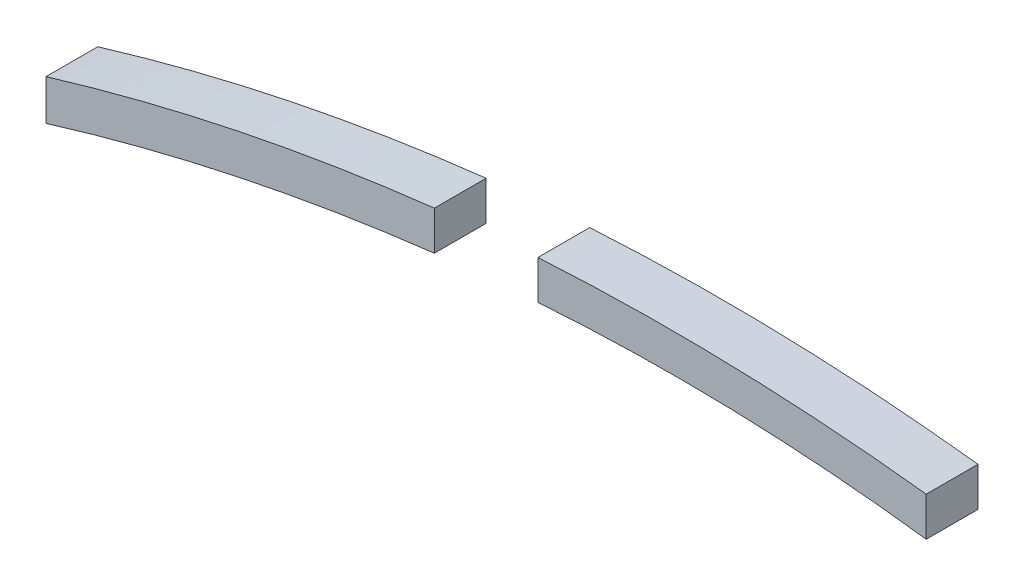
ISO-10303-21;
HEADER;
FILE_DESCRIPTION(('STEP AP214'),'2;1');
FILE_NAME('part.step','',(''),(''),'','','');
FILE_SCHEMA(('AUTOMOTIVE_DESIGN { 1 0 10303 214 1 1 1 1 }'));
ENDSEC;
DATA;
#1=APPLICATION_CONTEXT('core data for automotive mechanical design processes');
#2=APPLICATION_PROTOCOL_DEFINITION('international standard','automotive_design',2000,#1);
#3=PRODUCT_CONTEXT('',#1,'mechanical');
#4=PRODUCT('Part','Part','',(#3));
#5=PRODUCT_RELATED_PRODUCT_CATEGORY('part','',(#4));
#6=PRODUCT_DEFINITION_FORMATION('','',#4);
#7=PRODUCT_DEFINITION_CONTEXT('part definition',#1,'design');
#8=PRODUCT_DEFINITION('design','',#6,#7);
#9=PRODUCT_DEFINITION_SHAPE('','',#8);
#10=(LENGTH_UNIT() NAMED_UNIT(*) SI_UNIT(.MILLI.,.METRE.));
#11=(NAMED_UNIT(*) PLANE_ANGLE_UNIT() SI_UNIT($,.RADIAN.));
#12=(NAMED_UNIT(*) SI_UNIT($,.STERADIAN.) SOLID_ANGLE_UNIT());
#13=UNCERTAINTY_MEASURE_WITH_UNIT(LENGTH_MEASURE(1.E-05),#10,'distance_accuracy_value','');
#14=(GEOMETRIC_REPRESENTATION_CONTEXT(3) GLOBAL_UNCERTAINTY_ASSIGNED_CONTEXT((#13)) GLOBAL_UNIT_ASSIGNED_CONTEXT((#10,
#11,#12)) REPRESENTATION_CONTEXT('',''));
#15=CARTESIAN_POINT('',(0.,0.,0.));
#16=DIRECTION('',(0.,0.,1.));
#17=DIRECTION('',(1.,0.,0.));
#18=AXIS2_PLACEMENT_3D('',#15,#16,#17);
#19=CARTESIAN_POINT('',(7.12841427033649,-65.2005141054153,2.));
#20=DIRECTION('',(0.,0.,-1.));
#21=DIRECTION('',(-1.,0.,0.));
#22=AXIS2_PLACEMENT_3D('',#19,#20,#21);
#23=CYLINDRICAL_SURFACE('',#22,85.5053699096559);
#24=CARTESIAN_POINT('',(7.12841427033649,-65.2005141054153,0.));
#25=DIRECTION('',(0.,0.,1.));
#26=DIRECTION('',(-1.,0.,0.));
#27=AXIS2_PLACEMENT_3D('',#24,#25,#26);
#28=CIRCLE('',#27,85.5053699096559);
#29=CARTESIAN_POINT('',(17.,19.7331074973928,0.));
#30=VERTEX_POINT('',#29);
#31=CARTESIAN_POINT('',(2.,20.1509220304746,0.));
#32=VERTEX_POINT('',#31);
#33=EDGE_CURVE('E111',#30,#32,#28,.T.);
#34=ORIENTED_EDGE('',*,*,#33,.T.);
#35=DIRECTION('',(0.,0.,-1.));
#36=VECTOR('',#35,1.);
#37=CARTESIAN_POINT('',(2.,20.1509220304746,2.));
#38=LINE('',#37,#36);
#39=CARTESIAN_POINT('',(2.,20.1509220304746,2.));
#40=VERTEX_POINT('',#39);
#41=EDGE_CURVE('E12',#40,#32,#38,.T.);
#42=ORIENTED_EDGE('',*,*,#41,.F.);
#43=CARTESIAN_POINT('',(7.12841427033649,-65.2005141054153,2.));
#44=DIRECTION('',(0.,0.,1.));
#45=DIRECTION('',(-1.,0.,0.));
#46=AXIS2_PLACEMENT_3D('',#43,#44,#45);
#47=CIRCLE('',#46,85.5053699096559);
#48=CARTESIAN_POINT('',(17.,19.7331074973928,2.));
#49=VERTEX_POINT('',#48);
#50=EDGE_CURVE('E99',#49,#40,#47,.T.);
#51=ORIENTED_EDGE('',*,*,#50,.F.);
#52=DIRECTION('',(0.,0.,-1.));
#53=VECTOR('',#52,1.);
#54=CARTESIAN_POINT('',(17.,19.7331074973928,2.));
#55=LINE('',#54,#53);
#56=EDGE_CURVE('E107',#49,#30,#55,.T.);
#57=ORIENTED_EDGE('',*,*,#56,.T.);
#58=EDGE_LOOP('',(#34,#42,#51,#57));
#59=FACE_BOUND('',#58,.T.);
#60=ADVANCED_FACE('F48',(#59),#23,.T.);
#61=CARTESIAN_POINT('',(2.,20.1509220304746,2.));
#62=DIRECTION('',(1.,0.,0.));
#63=DIRECTION('',(0.,0.,-1.));
#64=AXIS2_PLACEMENT_3D('',#61,#62,#63);
#65=PLANE('',#64);
#66=DIRECTION('',(0.,-1.,0.));
#67=VECTOR('',#66,1.);
#68=CARTESIAN_POINT('',(2.,20.1509220304746,0.));
#69=LINE('',#68,#67);
#70=CARTESIAN_POINT('',(2.,18.6478527622486,0.));
#71=VERTEX_POINT('',#70);
#72=EDGE_CURVE('E103',#32,#71,#69,.T.);
#73=ORIENTED_EDGE('',*,*,#72,.T.);
#74=DIRECTION('',(0.,0.,-1.));
#75=VECTOR('',#74,1.);
#76=CARTESIAN_POINT('',(2.,18.6478527622486,2.));
#77=LINE('',#76,#75);
#78=CARTESIAN_POINT('',(2.,18.6478527622486,2.));
#79=VERTEX_POINT('',#78);
#80=EDGE_CURVE('E56',#79,#71,#77,.T.);
#81=ORIENTED_EDGE('',*,*,#80,.F.);
#82=DIRECTION('',(0.,-1.,0.));
#83=VECTOR('',#82,1.);
#84=CARTESIAN_POINT('',(2.,20.1509220304746,2.));
#85=LINE('',#84,#83);
#86=EDGE_CURVE('E94',#40,#79,#85,.T.);
#87=ORIENTED_EDGE('',*,*,#86,.F.);
#88=ORIENTED_EDGE('',*,*,#41,.T.);
#89=EDGE_LOOP('',(#73,#81,#87,#88));
#90=FACE_BOUND('',#89,.T.);
#91=ADVANCED_FACE('F102',(#90),#65,.F.);
#92=CARTESIAN_POINT('',(7.37690287780733,-56.6827347101204,2.));
#93=DIRECTION('',(0.,0.,-1.));
#94=DIRECTION('',(-1.,0.,0.));
#95=AXIS2_PLACEMENT_3D('',#92,#93,#94);
#96=CYLINDRICAL_SURFACE('',#95,75.5222384035961);
#97=CARTESIAN_POINT('',(7.37690287780733,-56.6827347101204,0.));
#98=DIRECTION('',(0.,0.,-1.));
#99=DIRECTION('',(-1.,0.,0.));
#100=AXIS2_PLACEMENT_3D('',#97,#98,#99);
#101=CIRCLE('',#100,75.5222384035961);
#102=CARTESIAN_POINT('',(17.,18.2239038158905,0.));
#103=VERTEX_POINT('',#102);
#104=EDGE_CURVE('E81',#71,#103,#101,.T.);
#105=ORIENTED_EDGE('',*,*,#104,.T.);
#106=DIRECTION('',(0.,0.,-1.));
#107=VECTOR('',#106,1.);
#108=CARTESIAN_POINT('',(17.,18.2239038158905,2.));
#109=LINE('',#108,#107);
#110=CARTESIAN_POINT('',(17.,18.2239038158905,2.));
#111=VERTEX_POINT('',#110);
#112=EDGE_CURVE('E104',#111,#103,#109,.T.);
#113=ORIENTED_EDGE('',*,*,#112,.F.);
#114=CARTESIAN_POINT('',(7.37690287780733,-56.6827347101204,2.));
#115=DIRECTION('',(0.,0.,-1.));
#116=DIRECTION('',(-1.,0.,0.));
#117=AXIS2_PLACEMENT_3D('',#114,#115,#116);
#118=CIRCLE('',#117,75.5222384035961);
#119=EDGE_CURVE('E97',#79,#111,#118,.T.);
#120=ORIENTED_EDGE('',*,*,#119,.F.);
#121=ORIENTED_EDGE('',*,*,#80,.T.);
#122=EDGE_LOOP('',(#105,#113,#120,#121));
#123=FACE_BOUND('',#122,.T.);
#124=ADVANCED_FACE('F105',(#123),#96,.F.);
#125=CARTESIAN_POINT('',(17.,19.7331074973928,2.));
#126=DIRECTION('',(-1.,0.,0.));
#127=DIRECTION('',(0.,-1.,0.));
#128=AXIS2_PLACEMENT_3D('',#125,#126,#127);
#129=PLANE('',#128);
#130=DIRECTION('',(0.,1.,0.));
#131=VECTOR('',#130,1.);
#132=CARTESIAN_POINT('',(17.,19.7331074973928,0.));
#133=LINE('',#132,#131);
#134=EDGE_CURVE('E87',#103,#30,#133,.T.);
#135=ORIENTED_EDGE('',*,*,#134,.T.);
#136=ORIENTED_EDGE('',*,*,#56,.F.);
#137=DIRECTION('',(0.,1.,0.));
#138=VECTOR('',#137,1.);
#139=CARTESIAN_POINT('',(17.,19.7331074973928,2.));
#140=LINE('',#139,#138);
#141=EDGE_CURVE('E64',#111,#49,#140,.T.);
#142=ORIENTED_EDGE('',*,*,#141,.F.);
#143=ORIENTED_EDGE('',*,*,#112,.T.);
#144=EDGE_LOOP('',(#135,#136,#142,#143));
#145=FACE_BOUND('',#144,.T.);
#146=ADVANCED_FACE('F118',(#145),#129,.F.);
#147=CARTESIAN_POINT('',(7.12841427033649,-65.2005141054153,2.));
#148=DIRECTION('',(0.,0.,-1.));
#149=DIRECTION('',(-1.,0.,0.));
#150=AXIS2_PLACEMENT_3D('',#147,#148,#149);
#151=PLANE('',#150);
#152=ORIENTED_EDGE('',*,*,#50,.T.);
#153=ORIENTED_EDGE('',*,*,#86,.T.);
#154=ORIENTED_EDGE('',*,*,#119,.T.);
#155=ORIENTED_EDGE('',*,*,#141,.T.);
#156=EDGE_LOOP('',(#152,#153,#154,#155));
#157=FACE_BOUND('',#156,.T.);
#158=ADVANCED_FACE('F95',(#157),#151,.F.);
#159=CARTESIAN_POINT('',(7.12841427033649,-65.2005141054153,0.));
#160=DIRECTION('',(0.,0.,-1.));
#161=DIRECTION('',(-1.,0.,0.));
#162=AXIS2_PLACEMENT_3D('',#159,#160,#161);
#163=PLANE('',#162);
#164=ORIENTED_EDGE('',*,*,#33,.F.);
#165=ORIENTED_EDGE('',*,*,#134,.F.);
#166=ORIENTED_EDGE('',*,*,#104,.F.);
#167=ORIENTED_EDGE('',*,*,#72,.F.);
#168=EDGE_LOOP('',(#164,#165,#166,#167));
#169=FACE_BOUND('',#168,.T.);
#170=ADVANCED_FACE('F121',(#169),#163,.T.);
#171=CLOSED_SHELL('',(#60,#91,#124,#146,#158,#170));
#172=MANIFOLD_SOLID_BREP('B2',#171);
#173=CARTESIAN_POINT('',(7.70108533717899,-64.9807828312889,2.));
#174=DIRECTION('',(0.,0.,-1.));
#175=DIRECTION('',(-1.,0.,0.));
#176=AXIS2_PLACEMENT_3D('',#173,#174,#175);
#177=CYLINDRICAL_SURFACE('',#176,85.3348762589931);
#178=CARTESIAN_POINT('',(7.70108533717899,-64.9807828312889,0.));
#179=DIRECTION('',(0.,0.,1.));
#180=DIRECTION('',(-1.,0.,0.));
#181=AXIS2_PLACEMENT_3D('',#178,#179,#180);
#182=CIRCLE('',#181,85.3348762589931);
#183=CARTESIAN_POINT('',(-2.,19.8008782129395,0.));
#184=VERTEX_POINT('',#183);
#185=CARTESIAN_POINT('',(-17.,16.700901096646,0.));
#186=VERTEX_POINT('',#185);
#187=EDGE_CURVE('E234',#184,#186,#182,.T.);
#188=ORIENTED_EDGE('',*,*,#187,.T.);
#189=DIRECTION('',(0.,0.,-1.));
#190=VECTOR('',#189,1.);
#191=CARTESIAN_POINT('',(-17.,16.700901096646,2.));
#192=LINE('',#191,#190);
#193=CARTESIAN_POINT('',(-17.,16.700901096646,2.));
#194=VERTEX_POINT('',#193);
#195=EDGE_CURVE('E46',#194,#186,#192,.T.);
#196=ORIENTED_EDGE('',*,*,#195,.F.);
#197=CARTESIAN_POINT('',(7.70108533717899,-64.9807828312889,2.));
#198=DIRECTION('',(0.,0.,1.));
#199=DIRECTION('',(-1.,0.,0.));
#200=AXIS2_PLACEMENT_3D('',#197,#198,#199);
#201=CIRCLE('',#200,85.3348762589931);
#202=CARTESIAN_POINT('',(-2.,19.8008782129395,2.));
#203=VERTEX_POINT('',#202);
#204=EDGE_CURVE('E222',#203,#194,#201,.T.);
#205=ORIENTED_EDGE('',*,*,#204,.F.);
#206=DIRECTION('',(0.,0.,-1.));
#207=VECTOR('',#206,1.);
#208=CARTESIAN_POINT('',(-2.,19.8008782129395,2.));
#209=LINE('',#208,#207);
#210=EDGE_CURVE('E230',#203,#184,#209,.T.);
#211=ORIENTED_EDGE('',*,*,#210,.T.);
#212=EDGE_LOOP('',(#188,#196,#205,#211));
#213=FACE_BOUND('',#212,.T.);
#214=ADVANCED_FACE('F171',(#213),#177,.T.);
#215=CARTESIAN_POINT('',(-17.,16.700901096646,2.));
#216=DIRECTION('',(1.,0.,0.));
#217=DIRECTION('',(0.,1.,0.));
#218=AXIS2_PLACEMENT_3D('',#215,#216,#217);
#219=PLANE('',#218);
#220=DIRECTION('',(0.,-1.,0.));
#221=VECTOR('',#220,1.);
#222=CARTESIAN_POINT('',(-17.,16.700901096646,0.));
#223=LINE('',#222,#221);
#224=CARTESIAN_POINT('',(-17.,15.1360360272765,0.));
#225=VERTEX_POINT('',#224);
#226=EDGE_CURVE('E226',#186,#225,#223,.T.);
#227=ORIENTED_EDGE('',*,*,#226,.T.);
#228=DIRECTION('',(0.,0.,-1.));
#229=VECTOR('',#228,1.);
#230=CARTESIAN_POINT('',(-17.,15.1360360272765,2.));
#231=LINE('',#230,#229);
#232=CARTESIAN_POINT('',(-17.,15.1360360272765,2.));
#233=VERTEX_POINT('',#232);
#234=EDGE_CURVE('E179',#233,#225,#231,.T.);
#235=ORIENTED_EDGE('',*,*,#234,.F.);
#236=DIRECTION('',(0.,-1.,0.));
#237=VECTOR('',#236,1.);
#238=CARTESIAN_POINT('',(-17.,16.700901096646,2.));
#239=LINE('',#238,#237);
#240=EDGE_CURVE('E217',#194,#233,#239,.T.);
#241=ORIENTED_EDGE('',*,*,#240,.F.);
#242=ORIENTED_EDGE('',*,*,#195,.T.);
#243=EDGE_LOOP('',(#227,#235,#241,#242));
#244=FACE_BOUND('',#243,.T.);
#245=ADVANCED_FACE('F225',(#244),#219,.F.);
#246=CARTESIAN_POINT('',(7.86610589388057,-65.8419977222149,2.));
#247=DIRECTION('',(0.,0.,-1.));
#248=DIRECTION('',(-1.,0.,0.));
#249=AXIS2_PLACEMENT_3D('',#246,#247,#248);
#250=CYLINDRICAL_SURFACE('',#249,84.7098882791109);
#251=CARTESIAN_POINT('',(7.86610589388057,-65.8419977222149,0.));
#252=DIRECTION('',(0.,0.,-1.));
#253=DIRECTION('',(-1.,0.,0.));
#254=AXIS2_PLACEMENT_3D('',#251,#252,#253);
#255=CIRCLE('',#254,84.7098882791109);
#256=CARTESIAN_POINT('',(-1.99999999999999,18.2913792856658,0.));
#257=VERTEX_POINT('',#256);
#258=EDGE_CURVE('E204',#225,#257,#255,.T.);
#259=ORIENTED_EDGE('',*,*,#258,.T.);
#260=DIRECTION('',(0.,0.,-1.));
#261=VECTOR('',#260,1.);
#262=CARTESIAN_POINT('',(-1.99999999999999,18.2913792856658,2.));
#263=LINE('',#262,#261);
#264=CARTESIAN_POINT('',(-1.99999999999999,18.2913792856658,2.));
#265=VERTEX_POINT('',#264);
#266=EDGE_CURVE('E227',#265,#257,#263,.T.);
#267=ORIENTED_EDGE('',*,*,#266,.F.);
#268=CARTESIAN_POINT('',(7.86610589388057,-65.8419977222149,2.));
#269=DIRECTION('',(0.,0.,-1.));
#270=DIRECTION('',(-1.,0.,0.));
#271=AXIS2_PLACEMENT_3D('',#268,#269,#270);
#272=CIRCLE('',#271,84.7098882791109);
#273=EDGE_CURVE('E220',#233,#265,#272,.T.);
#274=ORIENTED_EDGE('',*,*,#273,.F.);
#275=ORIENTED_EDGE('',*,*,#234,.T.);
#276=EDGE_LOOP('',(#259,#267,#274,#275));
#277=FACE_BOUND('',#276,.T.);
#278=ADVANCED_FACE('F228',(#277),#250,.F.);
#279=CARTESIAN_POINT('',(-2.,19.8008782129395,2.));
#280=DIRECTION('',(-1.,0.,0.));
#281=DIRECTION('',(0.,-1.,0.));
#282=AXIS2_PLACEMENT_3D('',#279,#280,#281);
#283=PLANE('',#282);
#284=DIRECTION('',(0.,1.,0.));
#285=VECTOR('',#284,1.);
#286=CARTESIAN_POINT('',(-2.,19.8008782129395,0.));
#287=LINE('',#286,#285);
#288=EDGE_CURVE('E210',#257,#184,#287,.T.);
#289=ORIENTED_EDGE('',*,*,#288,.T.);
#290=ORIENTED_EDGE('',*,*,#210,.F.);
#291=DIRECTION('',(0.,1.,0.));
#292=VECTOR('',#291,1.);
#293=CARTESIAN_POINT('',(-2.,19.8008782129395,2.));
#294=LINE('',#293,#292);
#295=EDGE_CURVE('E187',#265,#203,#294,.T.);
#296=ORIENTED_EDGE('',*,*,#295,.F.);
#297=ORIENTED_EDGE('',*,*,#266,.T.);
#298=EDGE_LOOP('',(#289,#290,#296,#297));
#299=FACE_BOUND('',#298,.T.);
#300=ADVANCED_FACE('F241',(#299),#283,.F.);
#301=CARTESIAN_POINT('',(7.70108533717899,-64.9807828312889,2.));
#302=DIRECTION('',(0.,0.,-1.));
#303=DIRECTION('',(-1.,0.,0.));
#304=AXIS2_PLACEMENT_3D('',#301,#302,#303);
#305=PLANE('',#304);
#306=ORIENTED_EDGE('',*,*,#204,.T.);
#307=ORIENTED_EDGE('',*,*,#240,.T.);
#308=ORIENTED_EDGE('',*,*,#273,.T.);
#309=ORIENTED_EDGE('',*,*,#295,.T.);
#310=EDGE_LOOP('',(#306,#307,#308,#309));
#311=FACE_BOUND('',#310,.T.);
#312=ADVANCED_FACE('F218',(#311),#305,.F.);
#313=CARTESIAN_POINT('',(7.70108533717899,-64.9807828312889,0.));
#314=DIRECTION('',(0.,0.,-1.));
#315=DIRECTION('',(-1.,0.,0.));
#316=AXIS2_PLACEMENT_3D('',#313,#314,#315);
#317=PLANE('',#316);
#318=ORIENTED_EDGE('',*,*,#187,.F.);
#319=ORIENTED_EDGE('',*,*,#288,.F.);
#320=ORIENTED_EDGE('',*,*,#258,.F.);
#321=ORIENTED_EDGE('',*,*,#226,.F.);
#322=EDGE_LOOP('',(#318,#319,#320,#321));
#323=FACE_BOUND('',#322,.T.);
#324=ADVANCED_FACE('F244',(#323),#317,.T.);
#325=CLOSED_SHELL('',(#214,#245,#278,#300,#312,#324));
#326=MANIFOLD_SOLID_BREP('B6',#325);
#327=ADVANCED_BREP_SHAPE_REPRESENTATION('',(#18,#172,#326),#14);
#328=SHAPE_DEFINITION_REPRESENTATION(#9,#327);
ENDSEC;
END-ISO-10303-21;
